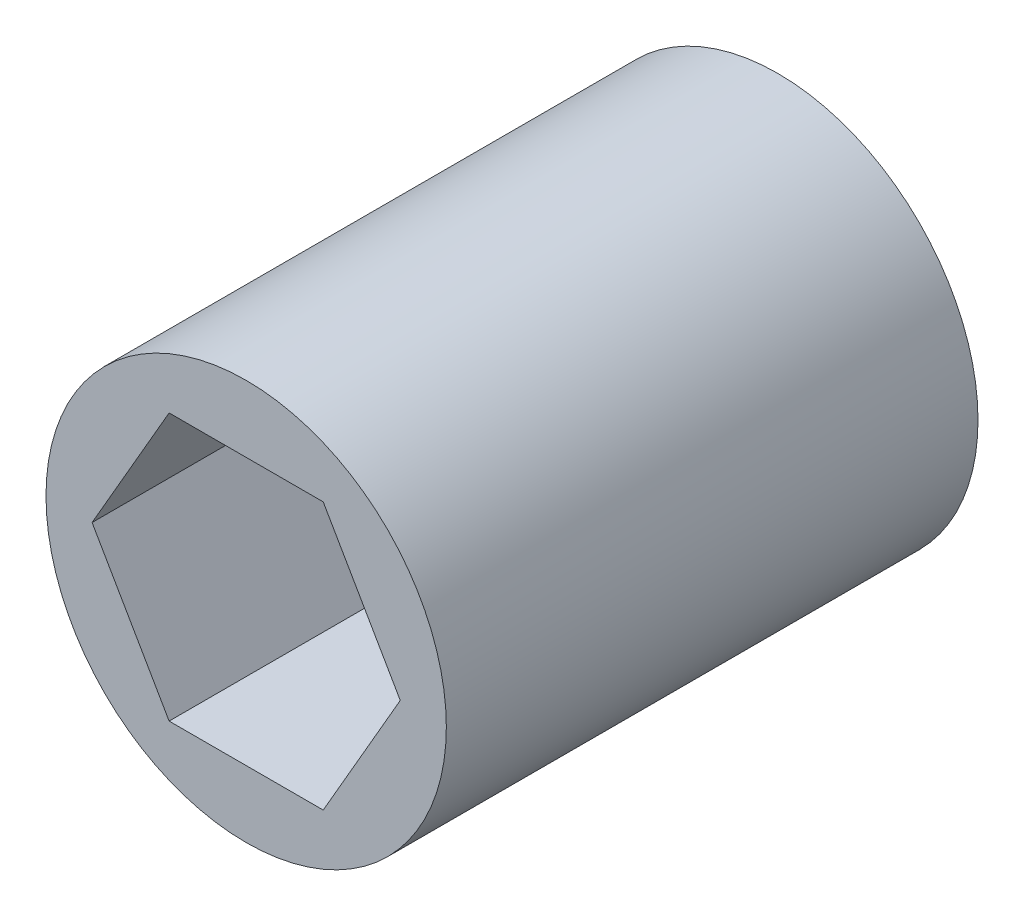
ISO-10303-21;
HEADER;
FILE_DESCRIPTION(('STEP AP214'),'2;1');
FILE_NAME('part.step','',(''),(''),'','','');
FILE_SCHEMA(('AUTOMOTIVE_DESIGN { 1 0 10303 214 1 1 1 1 }'));
ENDSEC;
DATA;
#1=APPLICATION_CONTEXT('core data for automotive mechanical design processes');
#2=APPLICATION_PROTOCOL_DEFINITION('international standard','automotive_design',2000,#1);
#3=PRODUCT_CONTEXT('',#1,'mechanical');
#4=PRODUCT('Part','Part','',(#3));
#5=PRODUCT_RELATED_PRODUCT_CATEGORY('part','',(#4));
#6=PRODUCT_DEFINITION_FORMATION('','',#4);
#7=PRODUCT_DEFINITION_CONTEXT('part definition',#1,'design');
#8=PRODUCT_DEFINITION('design','',#6,#7);
#9=PRODUCT_DEFINITION_SHAPE('','',#8);
#10=(LENGTH_UNIT() NAMED_UNIT(*) SI_UNIT(.MILLI.,.METRE.));
#11=(NAMED_UNIT(*) PLANE_ANGLE_UNIT() SI_UNIT($,.RADIAN.));
#12=(NAMED_UNIT(*) SI_UNIT($,.STERADIAN.) SOLID_ANGLE_UNIT());
#13=UNCERTAINTY_MEASURE_WITH_UNIT(LENGTH_MEASURE(1.E-05),#10,'distance_accuracy_value','');
#14=(GEOMETRIC_REPRESENTATION_CONTEXT(3) GLOBAL_UNCERTAINTY_ASSIGNED_CONTEXT((#13)) GLOBAL_UNIT_ASSIGNED_CONTEXT((#10,
#11,#12)) REPRESENTATION_CONTEXT('',''));
#15=CARTESIAN_POINT('',(0.,0.,0.));
#16=DIRECTION('',(0.,0.,1.));
#17=DIRECTION('',(1.,0.,0.));
#18=AXIS2_PLACEMENT_3D('',#15,#16,#17);
#19=CARTESIAN_POINT('',(0.,0.,25.2984));
#20=DIRECTION('',(0.,0.,1.));
#21=DIRECTION('',(1.,0.,0.));
#22=AXIS2_PLACEMENT_3D('',#19,#20,#21);
#23=PLANE('',#22);
#24=CARTESIAN_POINT('',(0.,0.,25.2984));
#25=DIRECTION('',(0.,0.,1.));
#26=DIRECTION('',(1.,0.,0.));
#27=AXIS2_PLACEMENT_3D('',#24,#25,#26);
#28=CIRCLE('',#27,9.525);
#29=CARTESIAN_POINT('',(9.525,0.,25.2984));
#30=VERTEX_POINT('',#29);
#31=EDGE_CURVE('E11',#30,#30,#28,.T.);
#32=ORIENTED_EDGE('',*,*,#31,.T.);
#33=EDGE_LOOP('',(#32));
#34=FACE_BOUND('',#33,.T.);
#35=DIRECTION('',(-0.5,-0.866025403784438,0.));
#36=VECTOR('',#35,1.);
#37=CARTESIAN_POINT('',(-3.66617420935412,6.35,25.2984));
#38=LINE('',#37,#36);
#39=CARTESIAN_POINT('',(-3.66617420935412,6.35,25.2984));
#40=VERTEX_POINT('',#39);
#41=CARTESIAN_POINT('',(-7.33234841870825,0.,25.2984));
#42=VERTEX_POINT('',#41);
#43=EDGE_CURVE('E98',#40,#42,#38,.T.);
#44=ORIENTED_EDGE('',*,*,#43,.F.);
#45=DIRECTION('',(-1.,0.,0.));
#46=VECTOR('',#45,1.);
#47=CARTESIAN_POINT('',(3.66617420935412,6.35,25.2984));
#48=LINE('',#47,#46);
#49=CARTESIAN_POINT('',(3.66617420935412,6.35,25.2984));
#50=VERTEX_POINT('',#49);
#51=EDGE_CURVE('E90',#50,#40,#48,.T.);
#52=ORIENTED_EDGE('',*,*,#51,.F.);
#53=DIRECTION('',(-0.5,0.866025403784439,0.));
#54=VECTOR('',#53,1.);
#55=CARTESIAN_POINT('',(7.33234841870825,0.,25.2984));
#56=LINE('',#55,#54);
#57=CARTESIAN_POINT('',(7.33234841870824,0.,25.2984));
#58=VERTEX_POINT('',#57);
#59=EDGE_CURVE('E118',#58,#50,#56,.T.);
#60=ORIENTED_EDGE('',*,*,#59,.F.);
#61=DIRECTION('',(0.5,0.866025403784439,0.));
#62=VECTOR('',#61,1.);
#63=CARTESIAN_POINT('',(3.66617420935412,-6.35,25.2984));
#64=LINE('',#63,#62);
#65=CARTESIAN_POINT('',(3.66617420935412,-6.35,25.2984));
#66=VERTEX_POINT('',#65);
#67=EDGE_CURVE('E116',#66,#58,#64,.T.);
#68=ORIENTED_EDGE('',*,*,#67,.F.);
#69=DIRECTION('',(1.,0.,0.));
#70=VECTOR('',#69,1.);
#71=CARTESIAN_POINT('',(-3.66617420935412,-6.35,25.2984));
#72=LINE('',#71,#70);
#73=CARTESIAN_POINT('',(-3.66617420935412,-6.35,25.2984));
#74=VERTEX_POINT('',#73);
#75=EDGE_CURVE('E112',#74,#66,#72,.T.);
#76=ORIENTED_EDGE('',*,*,#75,.F.);
#77=DIRECTION('',(0.5,-0.866025403784439,0.));
#78=VECTOR('',#77,1.);
#79=CARTESIAN_POINT('',(-7.33234841870825,0.,25.2984));
#80=LINE('',#79,#78);
#81=EDGE_CURVE('E110',#42,#74,#80,.T.);
#82=ORIENTED_EDGE('',*,*,#81,.F.);
#83=EDGE_LOOP('',(#44,#52,#60,#68,#76,#82));
#84=FACE_BOUND('',#83,.T.);
#85=ADVANCED_FACE('F37',(#34,#84),#23,.T.);
#86=CARTESIAN_POINT('',(0.,0.,0.));
#87=DIRECTION('',(0.,0.,1.));
#88=DIRECTION('',(1.,0.,0.));
#89=AXIS2_PLACEMENT_3D('',#86,#87,#88);
#90=PLANE('',#89);
#91=CARTESIAN_POINT('',(0.,0.,0.));
#92=DIRECTION('',(0.,0.,1.));
#93=DIRECTION('',(1.,0.,0.));
#94=AXIS2_PLACEMENT_3D('',#91,#92,#93);
#95=CIRCLE('',#94,9.525);
#96=CARTESIAN_POINT('',(9.525,0.,0.));
#97=VERTEX_POINT('',#96);
#98=EDGE_CURVE('E41',#97,#97,#95,.T.);
#99=ORIENTED_EDGE('',*,*,#98,.F.);
#100=EDGE_LOOP('',(#99));
#101=FACE_BOUND('',#100,.T.);
#102=DIRECTION('',(-1.,0.,0.));
#103=VECTOR('',#102,1.);
#104=CARTESIAN_POINT('',(3.66617420935412,6.35,0.));
#105=LINE('',#104,#103);
#106=CARTESIAN_POINT('',(3.66617420935412,6.35,0.));
#107=VERTEX_POINT('',#106);
#108=CARTESIAN_POINT('',(-3.66617420935412,6.35,0.));
#109=VERTEX_POINT('',#108);
#110=EDGE_CURVE('E60',#107,#109,#105,.T.);
#111=ORIENTED_EDGE('',*,*,#110,.T.);
#112=DIRECTION('',(-0.5,-0.866025403784438,0.));
#113=VECTOR('',#112,1.);
#114=CARTESIAN_POINT('',(-3.66617420935412,6.35,0.));
#115=LINE('',#114,#113);
#116=CARTESIAN_POINT('',(-7.33234841870825,0.,0.));
#117=VERTEX_POINT('',#116);
#118=EDGE_CURVE('E105',#109,#117,#115,.T.);
#119=ORIENTED_EDGE('',*,*,#118,.T.);
#120=DIRECTION('',(0.5,-0.866025403784439,0.));
#121=VECTOR('',#120,1.);
#122=CARTESIAN_POINT('',(-7.33234841870825,0.,0.));
#123=LINE('',#122,#121);
#124=CARTESIAN_POINT('',(-3.66617420935412,-6.35,0.));
#125=VERTEX_POINT('',#124);
#126=EDGE_CURVE('E122',#117,#125,#123,.T.);
#127=ORIENTED_EDGE('',*,*,#126,.T.);
#128=DIRECTION('',(1.,0.,0.));
#129=VECTOR('',#128,1.);
#130=CARTESIAN_POINT('',(-3.66617420935412,-6.35,0.));
#131=LINE('',#130,#129);
#132=CARTESIAN_POINT('',(3.66617420935412,-6.35,0.));
#133=VERTEX_POINT('',#132);
#134=EDGE_CURVE('E125',#125,#133,#131,.T.);
#135=ORIENTED_EDGE('',*,*,#134,.T.);
#136=DIRECTION('',(0.5,0.866025403784439,0.));
#137=VECTOR('',#136,1.);
#138=CARTESIAN_POINT('',(3.66617420935412,-6.35,0.));
#139=LINE('',#138,#137);
#140=CARTESIAN_POINT('',(7.33234841870825,0.,0.));
#141=VERTEX_POINT('',#140);
#142=EDGE_CURVE('E128',#133,#141,#139,.T.);
#143=ORIENTED_EDGE('',*,*,#142,.T.);
#144=DIRECTION('',(-0.5,0.866025403784439,0.));
#145=VECTOR('',#144,1.);
#146=CARTESIAN_POINT('',(7.33234841870825,0.,0.));
#147=LINE('',#146,#145);
#148=EDGE_CURVE('E99',#141,#107,#147,.T.);
#149=ORIENTED_EDGE('',*,*,#148,.T.);
#150=EDGE_LOOP('',(#111,#119,#127,#135,#143,#149));
#151=FACE_BOUND('',#150,.T.);
#152=ADVANCED_FACE('F145',(#101,#151),#90,.F.);
#153=CARTESIAN_POINT('',(0.,0.,25.2984));
#154=DIRECTION('',(0.,0.,-1.));
#155=DIRECTION('',(-1.,0.,0.));
#156=AXIS2_PLACEMENT_3D('',#153,#154,#155);
#157=CYLINDRICAL_SURFACE('',#156,9.525);
#158=ORIENTED_EDGE('',*,*,#31,.F.);
#159=EDGE_LOOP('',(#158));
#160=FACE_BOUND('',#159,.T.);
#161=ORIENTED_EDGE('',*,*,#98,.T.);
#162=EDGE_LOOP('',(#161));
#163=FACE_BOUND('',#162,.T.);
#164=ADVANCED_FACE('F39',(#160,#163),#157,.T.);
#165=CARTESIAN_POINT('',(3.66617420935412,6.35,25.2984));
#166=DIRECTION('',(0.,-1.,0.));
#167=DIRECTION('',(1.,0.,0.));
#168=AXIS2_PLACEMENT_3D('',#165,#166,#167);
#169=PLANE('',#168);
#170=ORIENTED_EDGE('',*,*,#110,.F.);
#171=DIRECTION('',(0.,0.,-1.));
#172=VECTOR('',#171,1.);
#173=CARTESIAN_POINT('',(3.66617420935412,6.35,25.2984));
#174=LINE('',#173,#172);
#175=EDGE_CURVE('E94',#50,#107,#174,.T.);
#176=ORIENTED_EDGE('',*,*,#175,.F.);
#177=ORIENTED_EDGE('',*,*,#51,.T.);
#178=DIRECTION('',(0.,0.,-1.));
#179=VECTOR('',#178,1.);
#180=CARTESIAN_POINT('',(-3.66617420935412,6.35,25.2984));
#181=LINE('',#180,#179);
#182=EDGE_CURVE('E93',#40,#109,#181,.T.);
#183=ORIENTED_EDGE('',*,*,#182,.T.);
#184=EDGE_LOOP('',(#170,#176,#177,#183));
#185=FACE_BOUND('',#184,.T.);
#186=ADVANCED_FACE('F92',(#185),#169,.T.);
#187=CARTESIAN_POINT('',(-3.66617420935412,6.35,25.2984));
#188=DIRECTION('',(0.866025403784438,-0.5,0.));
#189=DIRECTION('',(0.5,0.866025403784439,0.));
#190=AXIS2_PLACEMENT_3D('',#187,#188,#189);
#191=PLANE('',#190);
#192=ORIENTED_EDGE('',*,*,#118,.F.);
#193=ORIENTED_EDGE('',*,*,#182,.F.);
#194=ORIENTED_EDGE('',*,*,#43,.T.);
#195=DIRECTION('',(0.,0.,-1.));
#196=VECTOR('',#195,1.);
#197=CARTESIAN_POINT('',(-7.33234841870825,0.,25.2984));
#198=LINE('',#197,#196);
#199=EDGE_CURVE('E106',#42,#117,#198,.T.);
#200=ORIENTED_EDGE('',*,*,#199,.T.);
#201=EDGE_LOOP('',(#192,#193,#194,#200));
#202=FACE_BOUND('',#201,.T.);
#203=ADVANCED_FACE('F102',(#202),#191,.T.);
#204=CARTESIAN_POINT('',(-7.33234841870825,0.,25.2984));
#205=DIRECTION('',(0.866025403784439,0.5,0.));
#206=DIRECTION('',(-0.5,0.866025403784439,0.));
#207=AXIS2_PLACEMENT_3D('',#204,#205,#206);
#208=PLANE('',#207);
#209=ORIENTED_EDGE('',*,*,#126,.F.);
#210=ORIENTED_EDGE('',*,*,#199,.F.);
#211=ORIENTED_EDGE('',*,*,#81,.T.);
#212=DIRECTION('',(0.,0.,-1.));
#213=VECTOR('',#212,1.);
#214=CARTESIAN_POINT('',(-3.66617420935412,-6.35,25.2984));
#215=LINE('',#214,#213);
#216=EDGE_CURVE('E137',#74,#125,#215,.T.);
#217=ORIENTED_EDGE('',*,*,#216,.T.);
#218=EDGE_LOOP('',(#209,#210,#211,#217));
#219=FACE_BOUND('',#218,.T.);
#220=ADVANCED_FACE('F141',(#219),#208,.T.);
#221=CARTESIAN_POINT('',(-3.66617420935412,-6.35,25.2984));
#222=DIRECTION('',(0.,1.,0.));
#223=DIRECTION('',(0.,0.,1.));
#224=AXIS2_PLACEMENT_3D('',#221,#222,#223);
#225=PLANE('',#224);
#226=ORIENTED_EDGE('',*,*,#134,.F.);
#227=ORIENTED_EDGE('',*,*,#216,.F.);
#228=ORIENTED_EDGE('',*,*,#75,.T.);
#229=DIRECTION('',(0.,0.,-1.));
#230=VECTOR('',#229,1.);
#231=CARTESIAN_POINT('',(3.66617420935412,-6.35,25.2984));
#232=LINE('',#231,#230);
#233=EDGE_CURVE('E135',#66,#133,#232,.T.);
#234=ORIENTED_EDGE('',*,*,#233,.T.);
#235=EDGE_LOOP('',(#226,#227,#228,#234));
#236=FACE_BOUND('',#235,.T.);
#237=ADVANCED_FACE('F153',(#236),#225,.T.);
#238=CARTESIAN_POINT('',(3.66617420935412,-6.35,25.2984));
#239=DIRECTION('',(-0.866025403784439,0.5,0.));
#240=DIRECTION('',(-0.5,-0.866025403784439,0.));
#241=AXIS2_PLACEMENT_3D('',#238,#239,#240);
#242=PLANE('',#241);
#243=ORIENTED_EDGE('',*,*,#142,.F.);
#244=ORIENTED_EDGE('',*,*,#233,.F.);
#245=ORIENTED_EDGE('',*,*,#67,.T.);
#246=DIRECTION('',(0.,0.,-1.));
#247=VECTOR('',#246,1.);
#248=CARTESIAN_POINT('',(7.33234841870825,0.,25.2984));
#249=LINE('',#248,#247);
#250=EDGE_CURVE('E52',#58,#141,#249,.T.);
#251=ORIENTED_EDGE('',*,*,#250,.T.);
#252=EDGE_LOOP('',(#243,#244,#245,#251));
#253=FACE_BOUND('',#252,.T.);
#254=ADVANCED_FACE('F151',(#253),#242,.T.);
#255=CARTESIAN_POINT('',(7.33234841870825,0.,25.2984));
#256=DIRECTION('',(-0.866025403784439,-0.5,0.));
#257=DIRECTION('',(0.5,-0.866025403784439,0.));
#258=AXIS2_PLACEMENT_3D('',#255,#256,#257);
#259=PLANE('',#258);
#260=ORIENTED_EDGE('',*,*,#148,.F.);
#261=ORIENTED_EDGE('',*,*,#250,.F.);
#262=ORIENTED_EDGE('',*,*,#59,.T.);
#263=ORIENTED_EDGE('',*,*,#175,.T.);
#264=EDGE_LOOP('',(#260,#261,#262,#263));
#265=FACE_BOUND('',#264,.T.);
#266=ADVANCED_FACE('F147',(#265),#259,.T.);
#267=CLOSED_SHELL('',(#85,#152,#164,#186,#203,#220,#237,#254,#266));
#268=MANIFOLD_SOLID_BREP('B2',#267);
#269=ADVANCED_BREP_SHAPE_REPRESENTATION('',(#18,#268),#14);
#270=SHAPE_DEFINITION_REPRESENTATION(#9,#269);
ENDSEC;
END-ISO-10303-21;
